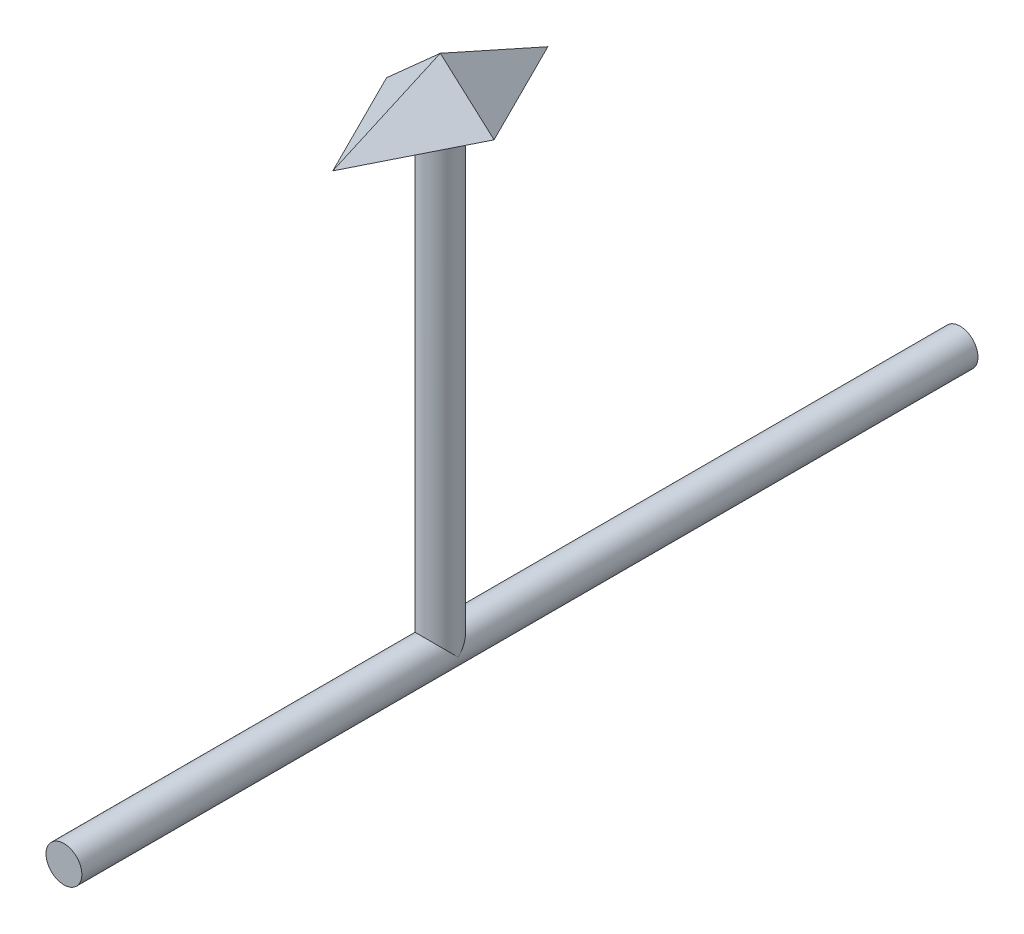
ISO-10303-21;
HEADER;
FILE_DESCRIPTION(('STEP AP214'),'2;1');
FILE_NAME('part.step','',(''),(''),'','','');
FILE_SCHEMA(('AUTOMOTIVE_DESIGN { 1 0 10303 214 1 1 1 1 }'));
ENDSEC;
DATA;
#1=APPLICATION_CONTEXT('core data for automotive mechanical design processes');
#2=APPLICATION_PROTOCOL_DEFINITION('international standard','automotive_design',2000,#1);
#3=PRODUCT_CONTEXT('',#1,'mechanical');
#4=PRODUCT('Part','Part','',(#3));
#5=PRODUCT_RELATED_PRODUCT_CATEGORY('part','',(#4));
#6=PRODUCT_DEFINITION_FORMATION('','',#4);
#7=PRODUCT_DEFINITION_CONTEXT('part definition',#1,'design');
#8=PRODUCT_DEFINITION('design','',#6,#7);
#9=PRODUCT_DEFINITION_SHAPE('','',#8);
#10=(LENGTH_UNIT() NAMED_UNIT(*) SI_UNIT(.MILLI.,.METRE.));
#11=(NAMED_UNIT(*) PLANE_ANGLE_UNIT() SI_UNIT($,.RADIAN.));
#12=(NAMED_UNIT(*) SI_UNIT($,.STERADIAN.) SOLID_ANGLE_UNIT());
#13=UNCERTAINTY_MEASURE_WITH_UNIT(LENGTH_MEASURE(1.E-05),#10,'distance_accuracy_value','');
#14=(GEOMETRIC_REPRESENTATION_CONTEXT(3) GLOBAL_UNCERTAINTY_ASSIGNED_CONTEXT((#13)) GLOBAL_UNIT_ASSIGNED_CONTEXT((#10,
#11,#12)) REPRESENTATION_CONTEXT('',''));
#15=CARTESIAN_POINT('',(0.,0.,0.));
#16=DIRECTION('',(0.,0.,1.));
#17=DIRECTION('',(1.,0.,0.));
#18=AXIS2_PLACEMENT_3D('',#15,#16,#17);
#19=CARTESIAN_POINT('',(0.,0.,600.));
#20=DIRECTION('',(0.,0.,-1.));
#21=DIRECTION('',(-1.,0.,0.));
#22=AXIS2_PLACEMENT_3D('',#19,#20,#21);
#23=CYLINDRICAL_SURFACE('',#22,5.);
#24=CARTESIAN_POINT('',(0.,0.,250.));
#25=DIRECTION('',(0.,0.,-1.));
#26=DIRECTION('',(-1.,0.,0.));
#27=AXIS2_PLACEMENT_3D('',#24,#25,#26);
#28=CIRCLE('',#27,5.);
#29=CARTESIAN_POINT('',(-5.,0.,250.));
#30=VERTEX_POINT('',#29);
#31=EDGE_CURVE('E47',#30,#30,#28,.T.);
#32=ORIENTED_EDGE('',*,*,#31,.T.);
#33=EDGE_LOOP('',(#32));
#34=FACE_BOUND('',#33,.T.);
#35=CARTESIAN_POINT('',(0.,0.,145.));
#36=DIRECTION('',(0.,-0.707106781186547,-0.707106781186547));
#37=DIRECTION('',(0.,0.707106781186547,-0.707106781186547));
#38=AXIS2_PLACEMENT_3D('',#35,#36,#37);
#39=ELLIPSE('',#38,7.07106781186548,5.);
#40=CARTESIAN_POINT('',(5.,0.,145.));
#41=VERTEX_POINT('',#40);
#42=CARTESIAN_POINT('',(-5.,0.,145.));
#43=VERTEX_POINT('',#42);
#44=EDGE_CURVE('E11',#41,#43,#39,.F.);
#45=ORIENTED_EDGE('',*,*,#44,.F.);
#46=CARTESIAN_POINT('',(0.,0.,145.));
#47=DIRECTION('',(0.,0.707106781186547,-0.707106781186547));
#48=DIRECTION('',(0.,-0.707106781186547,-0.707106781186547));
#49=AXIS2_PLACEMENT_3D('',#46,#47,#48);
#50=ELLIPSE('',#49,7.07106781186548,5.);
#51=EDGE_CURVE('E53',#43,#41,#50,.T.);
#52=ORIENTED_EDGE('',*,*,#51,.F.);
#53=EDGE_LOOP('',(#45,#52));
#54=FACE_BOUND('',#53,.T.);
#55=CARTESIAN_POINT('',(0.,0.,0.));
#56=DIRECTION('',(0.,0.,1.));
#57=DIRECTION('',(1.,0.,0.));
#58=AXIS2_PLACEMENT_3D('',#55,#56,#57);
#59=CIRCLE('',#58,5.);
#60=CARTESIAN_POINT('',(5.,0.,0.));
#61=VERTEX_POINT('',#60);
#62=EDGE_CURVE('E122',#61,#61,#59,.T.);
#63=ORIENTED_EDGE('',*,*,#62,.T.);
#64=EDGE_LOOP('',(#63));
#65=FACE_BOUND('',#64,.T.);
#66=ADVANCED_FACE('F44',(#34,#54,#65),#23,.T.);
#67=CARTESIAN_POINT('',(0.,0.,0.));
#68=DIRECTION('',(0.,0.,1.));
#69=DIRECTION('',(1.,0.,0.));
#70=AXIS2_PLACEMENT_3D('',#67,#68,#69);
#71=PLANE('',#70);
#72=ORIENTED_EDGE('',*,*,#62,.F.);
#73=EDGE_LOOP('',(#72));
#74=FACE_BOUND('',#73,.T.);
#75=ADVANCED_FACE('F130',(#74),#71,.F.);
#76=CARTESIAN_POINT('',(0.,130.,145.));
#77=DIRECTION('',(0.,-1.,0.));
#78=DIRECTION('',(0.,0.,-1.));
#79=AXIS2_PLACEMENT_3D('',#76,#77,#78);
#80=CYLINDRICAL_SURFACE('',#79,5.);
#81=CARTESIAN_POINT('',(0.,130.,145.));
#82=DIRECTION('',(0.,1.,0.));
#83=DIRECTION('',(0.,0.,1.));
#84=AXIS2_PLACEMENT_3D('',#81,#82,#83);
#85=CIRCLE('',#84,5.);
#86=CARTESIAN_POINT('',(0.,130.,150.));
#87=VERTEX_POINT('',#86);
#88=EDGE_CURVE('E96',#87,#87,#85,.T.);
#89=ORIENTED_EDGE('',*,*,#88,.F.);
#90=EDGE_LOOP('',(#89));
#91=FACE_BOUND('',#90,.T.);
#92=ORIENTED_EDGE('',*,*,#51,.T.);
#93=ORIENTED_EDGE('',*,*,#44,.T.);
#94=EDGE_LOOP('',(#92,#93));
#95=FACE_BOUND('',#94,.T.);
#96=ADVANCED_FACE('F128',(#91,#95),#80,.T.);
#97=CARTESIAN_POINT('',(0.,130.,115.));
#98=DIRECTION('',(0.632455532033675,0.707106781186549,-0.316227766016837));
#99=DIRECTION('',(-0.745355992499931,0.666666666666665,0.));
#100=AXIS2_PLACEMENT_3D('',#97,#98,#99);
#101=PLANE('',#100);
#102=DIRECTION('',(-0.447213595499958,0.,-0.894427190999916));
#103=VECTOR('',#102,1.);
#104=CARTESIAN_POINT('',(0.,130.,115.));
#105=LINE('',#104,#103);
#106=CARTESIAN_POINT('',(15.,130.,145.));
#107=VERTEX_POINT('',#106);
#108=CARTESIAN_POINT('',(0.,130.,115.));
#109=VERTEX_POINT('',#108);
#110=EDGE_CURVE('E83',#107,#109,#105,.T.);
#111=ORIENTED_EDGE('',*,*,#110,.T.);
#112=DIRECTION('',(0.,-0.408248290463862,-0.912870929175277));
#113=VECTOR('',#112,1.);
#114=CARTESIAN_POINT('',(0.,130.,115.));
#115=LINE('',#114,#113);
#116=CARTESIAN_POINT('',(0.,143.416407864999,145.));
#117=VERTEX_POINT('',#116);
#118=EDGE_CURVE('E90',#117,#109,#115,.T.);
#119=ORIENTED_EDGE('',*,*,#118,.F.);
#120=DIRECTION('',(0.745355992499931,-0.666666666666665,0.));
#121=VECTOR('',#120,1.);
#122=CARTESIAN_POINT('',(6.66666666666664,137.453559924999,145.));
#123=LINE('',#122,#121);
#124=EDGE_CURVE('E100',#117,#107,#123,.T.);
#125=ORIENTED_EDGE('',*,*,#124,.T.);
#126=EDGE_LOOP('',(#111,#119,#125));
#127=FACE_BOUND('',#126,.T.);
#128=ADVANCED_FACE('F98',(#127),#101,.T.);
#129=CARTESIAN_POINT('',(0.,130.,115.));
#130=DIRECTION('',(-0.632455532033675,0.707106781186549,-0.316227766016837));
#131=DIRECTION('',(-0.745355992499931,-0.666666666666665,0.));
#132=AXIS2_PLACEMENT_3D('',#129,#130,#131);
#133=PLANE('',#132);
#134=DIRECTION('',(-0.447213595499958,0.,0.894427190999916));
#135=VECTOR('',#134,1.);
#136=CARTESIAN_POINT('',(0.,130.,115.));
#137=LINE('',#136,#135);
#138=CARTESIAN_POINT('',(-15.,130.,145.));
#139=VERTEX_POINT('',#138);
#140=EDGE_CURVE('E78',#109,#139,#137,.T.);
#141=ORIENTED_EDGE('',*,*,#140,.T.);
#142=DIRECTION('',(-0.745355992499931,-0.666666666666665,0.));
#143=VECTOR('',#142,1.);
#144=CARTESIAN_POINT('',(-15.,130.,145.));
#145=LINE('',#144,#143);
#146=EDGE_CURVE('E92',#117,#139,#145,.T.);
#147=ORIENTED_EDGE('',*,*,#146,.F.);
#148=ORIENTED_EDGE('',*,*,#118,.T.);
#149=EDGE_LOOP('',(#141,#147,#148));
#150=FACE_BOUND('',#149,.T.);
#151=ADVANCED_FACE('F91',(#150),#133,.T.);
#152=CARTESIAN_POINT('',(-15.,130.,145.));
#153=DIRECTION('',(-0.632455532033675,0.707106781186549,0.316227766016837));
#154=DIRECTION('',(-0.745355992499931,-0.666666666666665,0.));
#155=AXIS2_PLACEMENT_3D('',#152,#153,#154);
#156=PLANE('',#155);
#157=DIRECTION('',(0.447213595499958,0.,0.894427190999916));
#158=VECTOR('',#157,1.);
#159=CARTESIAN_POINT('',(-15.,130.,145.));
#160=LINE('',#159,#158);
#161=CARTESIAN_POINT('',(0.,130.,175.));
#162=VERTEX_POINT('',#161);
#163=EDGE_CURVE('E85',#139,#162,#160,.T.);
#164=ORIENTED_EDGE('',*,*,#163,.T.);
#165=DIRECTION('',(0.,-0.408248290463862,0.912870929175277));
#166=VECTOR('',#165,1.);
#167=CARTESIAN_POINT('',(0.,141.180339887499,150.));
#168=LINE('',#167,#166);
#169=EDGE_CURVE('E114',#117,#162,#168,.T.);
#170=ORIENTED_EDGE('',*,*,#169,.F.);
#171=ORIENTED_EDGE('',*,*,#146,.T.);
#172=EDGE_LOOP('',(#164,#170,#171));
#173=FACE_BOUND('',#172,.T.);
#174=ADVANCED_FACE('F161',(#173),#156,.T.);
#175=CARTESIAN_POINT('',(15.,130.,145.));
#176=DIRECTION('',(0.632455532033675,0.707106781186549,0.316227766016837));
#177=DIRECTION('',(-0.745355992499931,0.666666666666665,0.));
#178=AXIS2_PLACEMENT_3D('',#175,#176,#177);
#179=PLANE('',#178);
#180=DIRECTION('',(0.447213595499958,0.,-0.894427190999916));
#181=VECTOR('',#180,1.);
#182=CARTESIAN_POINT('',(15.,130.,145.));
#183=LINE('',#182,#181);
#184=EDGE_CURVE('E109',#162,#107,#183,.T.);
#185=ORIENTED_EDGE('',*,*,#184,.T.);
#186=ORIENTED_EDGE('',*,*,#124,.F.);
#187=ORIENTED_EDGE('',*,*,#169,.T.);
#188=EDGE_LOOP('',(#185,#186,#187));
#189=FACE_BOUND('',#188,.T.);
#190=ADVANCED_FACE('F155',(#189),#179,.T.);
#191=CARTESIAN_POINT('',(0.,130.,0.));
#192=DIRECTION('',(0.,-1.,0.));
#193=DIRECTION('',(0.,0.,-1.));
#194=AXIS2_PLACEMENT_3D('',#191,#192,#193);
#195=PLANE('',#194);
#196=ORIENTED_EDGE('',*,*,#88,.T.);
#197=EDGE_LOOP('',(#196));
#198=FACE_BOUND('',#197,.T.);
#199=ORIENTED_EDGE('',*,*,#110,.F.);
#200=ORIENTED_EDGE('',*,*,#184,.F.);
#201=ORIENTED_EDGE('',*,*,#163,.F.);
#202=ORIENTED_EDGE('',*,*,#140,.F.);
#203=EDGE_LOOP('',(#199,#200,#201,#202));
#204=FACE_BOUND('',#203,.T.);
#205=ADVANCED_FACE('F80',(#198,#204),#195,.T.);
#206=CARTESIAN_POINT('',(-268.616548007986,-100.,250.));
#207=DIRECTION('',(0.,0.,-1.));
#208=DIRECTION('',(-1.,0.,0.));
#209=AXIS2_PLACEMENT_3D('',#206,#207,#208);
#210=PLANE('',#209);
#211=ORIENTED_EDGE('',*,*,#31,.F.);
#212=EDGE_LOOP('',(#211));
#213=FACE_BOUND('',#212,.T.);
#214=ADVANCED_FACE('F151',(#213),#210,.F.);
#215=CLOSED_SHELL('',(#66,#75,#96,#128,#151,#174,#190,#205,#214));
#216=MANIFOLD_SOLID_BREP('B2',#215);
#217=ADVANCED_BREP_SHAPE_REPRESENTATION('',(#18,#216),#14);
#218=SHAPE_DEFINITION_REPRESENTATION(#9,#217);
ENDSEC;
END-ISO-10303-21;
